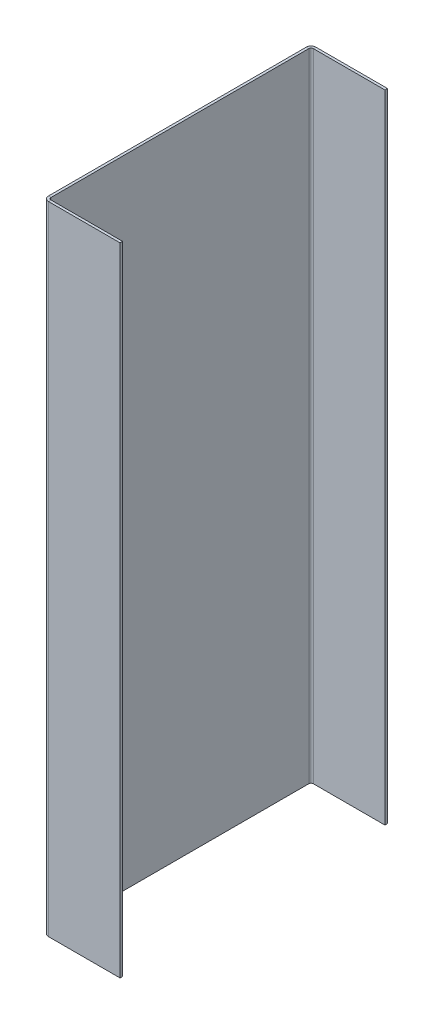
ISO-10303-21;
HEADER;
FILE_DESCRIPTION(('STEP AP214'),'2;1');
FILE_NAME('part.step','',(''),(''),'','','');
FILE_SCHEMA(('AUTOMOTIVE_DESIGN { 1 0 10303 214 1 1 1 1 }'));
ENDSEC;
DATA;
#1=APPLICATION_CONTEXT('core data for automotive mechanical design processes');
#2=APPLICATION_PROTOCOL_DEFINITION('international standard','automotive_design',2000,#1);
#3=PRODUCT_CONTEXT('',#1,'mechanical');
#4=PRODUCT('Part','Part','',(#3));
#5=PRODUCT_RELATED_PRODUCT_CATEGORY('part','',(#4));
#6=PRODUCT_DEFINITION_FORMATION('','',#4);
#7=PRODUCT_DEFINITION_CONTEXT('part definition',#1,'design');
#8=PRODUCT_DEFINITION('design','',#6,#7);
#9=PRODUCT_DEFINITION_SHAPE('','',#8);
#10=(LENGTH_UNIT() NAMED_UNIT(*) SI_UNIT(.MILLI.,.METRE.));
#11=(NAMED_UNIT(*) PLANE_ANGLE_UNIT() SI_UNIT($,.RADIAN.));
#12=(NAMED_UNIT(*) SI_UNIT($,.STERADIAN.) SOLID_ANGLE_UNIT());
#13=UNCERTAINTY_MEASURE_WITH_UNIT(LENGTH_MEASURE(1.E-05),#10,'distance_accuracy_value','');
#14=(GEOMETRIC_REPRESENTATION_CONTEXT(3) GLOBAL_UNCERTAINTY_ASSIGNED_CONTEXT((#13)) GLOBAL_UNIT_ASSIGNED_CONTEXT((#10,
#11,#12)) REPRESENTATION_CONTEXT('',''));
#15=CARTESIAN_POINT('',(0.,0.,0.));
#16=DIRECTION('',(0.,0.,1.));
#17=DIRECTION('',(1.,0.,0.));
#18=AXIS2_PLACEMENT_3D('',#15,#16,#17);
#19=CARTESIAN_POINT('',(2.,0.,210.));
#20=DIRECTION('',(-1.,0.,0.));
#21=DIRECTION('',(0.,0.,1.));
#22=AXIS2_PLACEMENT_3D('',#19,#20,#21);
#23=PLANE('',#22);
#24=DIRECTION('',(0.,-1.,0.));
#25=VECTOR('',#24,1.);
#26=CARTESIAN_POINT('',(2.,0.,206.2));
#27=LINE('',#26,#25);
#28=CARTESIAN_POINT('',(2.,0.,206.2));
#29=VERTEX_POINT('',#28);
#30=CARTESIAN_POINT('',(2.,500.,206.2));
#31=VERTEX_POINT('',#30);
#32=EDGE_CURVE('E218',#29,#31,#27,.F.);
#33=ORIENTED_EDGE('',*,*,#32,.F.);
#34=DIRECTION('',(0.,0.,-1.));
#35=VECTOR('',#34,1.);
#36=CARTESIAN_POINT('',(2.,0.,210.));
#37=LINE('',#36,#35);
#38=CARTESIAN_POINT('',(1.99999999999999,0.,3.79999999999999));
#39=VERTEX_POINT('',#38);
#40=EDGE_CURVE('E275',#29,#39,#37,.T.);
#41=ORIENTED_EDGE('',*,*,#40,.T.);
#42=DIRECTION('',(0.,1.,0.));
#43=VECTOR('',#42,1.);
#44=CARTESIAN_POINT('',(1.99999999999999,500.,3.79999999999999));
#45=LINE('',#44,#43);
#46=CARTESIAN_POINT('',(1.99999999999999,500.,3.79999999999999));
#47=VERTEX_POINT('',#46);
#48=EDGE_CURVE('E269',#47,#39,#45,.F.);
#49=ORIENTED_EDGE('',*,*,#48,.F.);
#50=DIRECTION('',(0.,0.,-1.));
#51=VECTOR('',#50,1.);
#52=CARTESIAN_POINT('',(2.,500.,210.));
#53=LINE('',#52,#51);
#54=EDGE_CURVE('E13',#31,#47,#53,.T.);
#55=ORIENTED_EDGE('',*,*,#54,.F.);
#56=EDGE_LOOP('',(#33,#41,#49,#55));
#57=FACE_BOUND('',#56,.T.);
#58=ADVANCED_FACE('F77',(#57),#23,.F.);
#59=CARTESIAN_POINT('',(0.,0.,210.));
#60=DIRECTION('',(-1.,0.,0.));
#61=DIRECTION('',(0.,0.,1.));
#62=AXIS2_PLACEMENT_3D('',#59,#60,#61);
#63=PLANE('',#62);
#64=DIRECTION('',(0.,0.,-1.));
#65=VECTOR('',#64,1.);
#66=CARTESIAN_POINT('',(0.,0.,210.));
#67=LINE('',#66,#65);
#68=CARTESIAN_POINT('',(0.,0.,206.2));
#69=VERTEX_POINT('',#68);
#70=CARTESIAN_POINT('',(0.,0.,3.79999999999999));
#71=VERTEX_POINT('',#70);
#72=EDGE_CURVE('E280',#69,#71,#67,.T.);
#73=ORIENTED_EDGE('',*,*,#72,.F.);
#74=DIRECTION('',(0.,-1.,0.));
#75=VECTOR('',#74,1.);
#76=CARTESIAN_POINT('',(0.,0.,206.2));
#77=LINE('',#76,#75);
#78=CARTESIAN_POINT('',(0.,500.,206.2));
#79=VERTEX_POINT('',#78);
#80=EDGE_CURVE('E207',#69,#79,#77,.F.);
#81=ORIENTED_EDGE('',*,*,#80,.T.);
#82=DIRECTION('',(0.,0.,-1.));
#83=VECTOR('',#82,1.);
#84=CARTESIAN_POINT('',(0.,500.,210.));
#85=LINE('',#84,#83);
#86=CARTESIAN_POINT('',(0.,500.,3.79999999999999));
#87=VERTEX_POINT('',#86);
#88=EDGE_CURVE('E84',#79,#87,#85,.T.);
#89=ORIENTED_EDGE('',*,*,#88,.T.);
#90=DIRECTION('',(0.,1.,0.));
#91=VECTOR('',#90,1.);
#92=CARTESIAN_POINT('',(0.,500.,3.79999999999999));
#93=LINE('',#92,#91);
#94=EDGE_CURVE('E258',#87,#71,#93,.F.);
#95=ORIENTED_EDGE('',*,*,#94,.T.);
#96=EDGE_LOOP('',(#73,#81,#89,#95));
#97=FACE_BOUND('',#96,.T.);
#98=ADVANCED_FACE('F286',(#97),#63,.T.);
#99=CARTESIAN_POINT('',(2.,0.,210.));
#100=DIRECTION('',(0.,-1.,0.));
#101=DIRECTION('',(0.,0.,-1.));
#102=AXIS2_PLACEMENT_3D('',#99,#100,#101);
#103=PLANE('',#102);
#104=ORIENTED_EDGE('',*,*,#40,.F.);
#105=DIRECTION('',(-1.,0.,0.));
#106=VECTOR('',#105,1.);
#107=CARTESIAN_POINT('',(2.,0.,206.2));
#108=LINE('',#107,#106);
#109=EDGE_CURVE('E212',#29,#69,#108,.T.);
#110=ORIENTED_EDGE('',*,*,#109,.T.);
#111=ORIENTED_EDGE('',*,*,#72,.T.);
#112=DIRECTION('',(-1.,0.,0.));
#113=VECTOR('',#112,1.);
#114=CARTESIAN_POINT('',(1.99999999999999,0.,3.79999999999999));
#115=LINE('',#114,#113);
#116=EDGE_CURVE('E273',#39,#71,#115,.T.);
#117=ORIENTED_EDGE('',*,*,#116,.F.);
#118=EDGE_LOOP('',(#104,#110,#111,#117));
#119=FACE_BOUND('',#118,.T.);
#120=ADVANCED_FACE('F325',(#119),#103,.T.);
#121=CARTESIAN_POINT('',(0.,500.,210.));
#122=DIRECTION('',(0.,1.,0.));
#123=DIRECTION('',(0.,0.,1.));
#124=AXIS2_PLACEMENT_3D('',#121,#122,#123);
#125=PLANE('',#124);
#126=DIRECTION('',(-1.,0.,0.));
#127=VECTOR('',#126,1.);
#128=CARTESIAN_POINT('',(2.,500.,206.2));
#129=LINE('',#128,#127);
#130=EDGE_CURVE('E223',#31,#79,#129,.T.);
#131=ORIENTED_EDGE('',*,*,#130,.F.);
#132=ORIENTED_EDGE('',*,*,#54,.T.);
#133=DIRECTION('',(-1.,0.,0.));
#134=VECTOR('',#133,1.);
#135=CARTESIAN_POINT('',(1.99999999999999,500.,3.79999999999999));
#136=LINE('',#135,#134);
#137=EDGE_CURVE('E263',#47,#87,#136,.T.);
#138=ORIENTED_EDGE('',*,*,#137,.T.);
#139=ORIENTED_EDGE('',*,*,#88,.F.);
#140=EDGE_LOOP('',(#131,#132,#138,#139));
#141=FACE_BOUND('',#140,.T.);
#142=ADVANCED_FACE('F289',(#141),#125,.T.);
#143=CARTESIAN_POINT('',(3.79999999999999,0.,3.79999999999999));
#144=DIRECTION('',(0.,-1.,0.));
#145=DIRECTION('',(0.,0.,-1.));
#146=AXIS2_PLACEMENT_3D('',#143,#144,#145);
#147=PLANE('',#146);
#148=DIRECTION('',(0.,0.,1.));
#149=VECTOR('',#148,1.);
#150=CARTESIAN_POINT('',(3.79999999999999,0.,0.));
#151=LINE('',#150,#149);
#152=CARTESIAN_POINT('',(3.79999999999999,0.,1.99999999999999));
#153=VERTEX_POINT('',#152);
#154=CARTESIAN_POINT('',(3.79999999999998,0.,0.));
#155=VERTEX_POINT('',#154);
#156=EDGE_CURVE('E225',#153,#155,#151,.F.);
#157=ORIENTED_EDGE('',*,*,#156,.F.);
#158=CARTESIAN_POINT('',(3.79999999999999,0.,3.79999999999999));
#159=DIRECTION('',(0.,1.,0.));
#160=DIRECTION('',(0.,0.,1.));
#161=AXIS2_PLACEMENT_3D('',#158,#159,#160);
#162=CIRCLE('',#161,1.8);
#163=EDGE_CURVE('E266',#39,#153,#162,.F.);
#164=ORIENTED_EDGE('',*,*,#163,.F.);
#165=ORIENTED_EDGE('',*,*,#116,.T.);
#166=CARTESIAN_POINT('',(3.79999999999999,0.,3.79999999999999));
#167=DIRECTION('',(0.,1.,0.));
#168=DIRECTION('',(0.,0.,1.));
#169=AXIS2_PLACEMENT_3D('',#166,#167,#168);
#170=CIRCLE('',#169,3.8);
#171=EDGE_CURVE('E91',#71,#155,#170,.F.);
#172=ORIENTED_EDGE('',*,*,#171,.T.);
#173=EDGE_LOOP('',(#157,#164,#165,#172));
#174=FACE_BOUND('',#173,.T.);
#175=ADVANCED_FACE('F321',(#174),#147,.T.);
#176=CARTESIAN_POINT('',(3.79999999999999,500.,3.79999999999999));
#177=DIRECTION('',(0.,-1.,0.));
#178=DIRECTION('',(0.,0.,-1.));
#179=AXIS2_PLACEMENT_3D('',#176,#177,#178);
#180=PLANE('',#179);
#181=CARTESIAN_POINT('',(3.79999999999999,500.,3.79999999999999));
#182=DIRECTION('',(0.,1.,0.));
#183=DIRECTION('',(0.,0.,1.));
#184=AXIS2_PLACEMENT_3D('',#181,#182,#183);
#185=CIRCLE('',#184,1.8);
#186=CARTESIAN_POINT('',(3.79999999999999,500.,1.99999999999999));
#187=VERTEX_POINT('',#186);
#188=EDGE_CURVE('E231',#187,#47,#185,.T.);
#189=ORIENTED_EDGE('',*,*,#188,.F.);
#190=DIRECTION('',(0.,0.,1.));
#191=VECTOR('',#190,1.);
#192=CARTESIAN_POINT('',(3.79999999999999,500.,1.99999999999999));
#193=LINE('',#192,#191);
#194=CARTESIAN_POINT('',(3.79999999999999,500.,0.));
#195=VERTEX_POINT('',#194);
#196=EDGE_CURVE('E251',#187,#195,#193,.F.);
#197=ORIENTED_EDGE('',*,*,#196,.T.);
#198=CARTESIAN_POINT('',(3.79999999999999,500.,3.79999999999999));
#199=DIRECTION('',(0.,1.,0.));
#200=DIRECTION('',(0.,0.,1.));
#201=AXIS2_PLACEMENT_3D('',#198,#199,#200);
#202=CIRCLE('',#201,3.8);
#203=EDGE_CURVE('E261',#195,#87,#202,.T.);
#204=ORIENTED_EDGE('',*,*,#203,.T.);
#205=ORIENTED_EDGE('',*,*,#137,.F.);
#206=EDGE_LOOP('',(#189,#197,#204,#205));
#207=FACE_BOUND('',#206,.T.);
#208=ADVANCED_FACE('F294',(#207),#180,.F.);
#209=CARTESIAN_POINT('',(3.79999999999999,500.,3.79999999999999));
#210=DIRECTION('',(0.,1.,0.));
#211=DIRECTION('',(0.,0.,-1.));
#212=AXIS2_PLACEMENT_3D('',#209,#210,#211);
#213=CYLINDRICAL_SURFACE('',#212,3.8);
#214=ORIENTED_EDGE('',*,*,#94,.F.);
#215=ORIENTED_EDGE('',*,*,#203,.F.);
#216=DIRECTION('',(0.,1.,0.));
#217=VECTOR('',#216,1.);
#218=CARTESIAN_POINT('',(3.79999999999999,0.,0.));
#219=LINE('',#218,#217);
#220=EDGE_CURVE('E249',#195,#155,#219,.F.);
#221=ORIENTED_EDGE('',*,*,#220,.T.);
#222=ORIENTED_EDGE('',*,*,#171,.F.);
#223=EDGE_LOOP('',(#214,#215,#221,#222));
#224=FACE_BOUND('',#223,.T.);
#225=ADVANCED_FACE('F319',(#224),#213,.T.);
#226=CARTESIAN_POINT('',(3.79999999999999,500.,3.79999999999999));
#227=DIRECTION('',(0.,1.,0.));
#228=DIRECTION('',(0.,0.,-1.));
#229=AXIS2_PLACEMENT_3D('',#226,#227,#228);
#230=CYLINDRICAL_SURFACE('',#229,1.8);
#231=ORIENTED_EDGE('',*,*,#48,.T.);
#232=ORIENTED_EDGE('',*,*,#163,.T.);
#233=DIRECTION('',(0.,1.,0.));
#234=VECTOR('',#233,1.);
#235=CARTESIAN_POINT('',(3.79999999999999,0.,1.99999999999999));
#236=LINE('',#235,#234);
#237=EDGE_CURVE('E254',#153,#187,#236,.T.);
#238=ORIENTED_EDGE('',*,*,#237,.T.);
#239=ORIENTED_EDGE('',*,*,#188,.T.);
#240=EDGE_LOOP('',(#231,#232,#238,#239));
#241=FACE_BOUND('',#240,.T.);
#242=ADVANCED_FACE('F297',(#241),#230,.F.);
#243=CARTESIAN_POINT('',(1.99999999999999,0.,0.));
#244=DIRECTION('',(0.,1.,0.));
#245=DIRECTION('',(0.,0.,1.));
#246=AXIS2_PLACEMENT_3D('',#243,#244,#245);
#247=PLANE('',#246);
#248=ORIENTED_EDGE('',*,*,#156,.T.);
#249=DIRECTION('',(-1.,0.,0.));
#250=VECTOR('',#249,1.);
#251=CARTESIAN_POINT('',(60.,0.,-2.02528965820292E-13));
#252=LINE('',#251,#250);
#253=CARTESIAN_POINT('',(60.,0.,-2.02528965820292E-13));
#254=VERTEX_POINT('',#253);
#255=EDGE_CURVE('E239',#254,#155,#252,.T.);
#256=ORIENTED_EDGE('',*,*,#255,.F.);
#257=DIRECTION('',(0.,0.,1.));
#258=VECTOR('',#257,1.);
#259=CARTESIAN_POINT('',(60.,0.,-2.02505917652902E-13));
#260=LINE('',#259,#258);
#261=CARTESIAN_POINT('',(60.,0.,1.9999999999998));
#262=VERTEX_POINT('',#261);
#263=EDGE_CURVE('E232',#254,#262,#260,.T.);
#264=ORIENTED_EDGE('',*,*,#263,.T.);
#265=DIRECTION('',(1.,0.,0.));
#266=VECTOR('',#265,1.);
#267=CARTESIAN_POINT('',(2.,0.,2.));
#268=LINE('',#267,#266);
#269=EDGE_CURVE('E246',#262,#153,#268,.F.);
#270=ORIENTED_EDGE('',*,*,#269,.T.);
#271=EDGE_LOOP('',(#248,#256,#264,#270));
#272=FACE_BOUND('',#271,.T.);
#273=ADVANCED_FACE('F306',(#272),#247,.F.);
#274=CARTESIAN_POINT('',(60.,500.,-2.02528965820292E-13));
#275=DIRECTION('',(0.,-1.,0.));
#276=DIRECTION('',(0.,0.,-1.));
#277=AXIS2_PLACEMENT_3D('',#274,#275,#276);
#278=PLANE('',#277);
#279=ORIENTED_EDGE('',*,*,#196,.F.);
#280=DIRECTION('',(-1.,0.,0.));
#281=VECTOR('',#280,1.);
#282=CARTESIAN_POINT('',(60.,500.,1.9999999999998));
#283=LINE('',#282,#281);
#284=CARTESIAN_POINT('',(60.,500.,1.9999999999998));
#285=VERTEX_POINT('',#284);
#286=EDGE_CURVE('E244',#187,#285,#283,.F.);
#287=ORIENTED_EDGE('',*,*,#286,.T.);
#288=DIRECTION('',(0.,0.,1.));
#289=VECTOR('',#288,1.);
#290=CARTESIAN_POINT('',(60.,500.,-2.02528965820292E-13));
#291=LINE('',#290,#289);
#292=CARTESIAN_POINT('',(60.,500.,-2.02528965820292E-13));
#293=VERTEX_POINT('',#292);
#294=EDGE_CURVE('E228',#293,#285,#291,.T.);
#295=ORIENTED_EDGE('',*,*,#294,.F.);
#296=DIRECTION('',(1.,0.,0.));
#297=VECTOR('',#296,1.);
#298=CARTESIAN_POINT('',(60.,500.,-2.02528965820292E-13));
#299=LINE('',#298,#297);
#300=EDGE_CURVE('E237',#195,#293,#299,.T.);
#301=ORIENTED_EDGE('',*,*,#300,.F.);
#302=EDGE_LOOP('',(#279,#287,#295,#301));
#303=FACE_BOUND('',#302,.T.);
#304=ADVANCED_FACE('F315',(#303),#278,.F.);
#305=CARTESIAN_POINT('',(60.,0.,-2.02528965820292E-13));
#306=DIRECTION('',(0.,0.,1.));
#307=DIRECTION('',(1.,0.,0.));
#308=AXIS2_PLACEMENT_3D('',#305,#306,#307);
#309=PLANE('',#308);
#310=ORIENTED_EDGE('',*,*,#220,.F.);
#311=ORIENTED_EDGE('',*,*,#300,.T.);
#312=DIRECTION('',(0.,-1.,0.));
#313=VECTOR('',#312,1.);
#314=CARTESIAN_POINT('',(60.,0.,-2.02528965820292E-13));
#315=LINE('',#314,#313);
#316=EDGE_CURVE('E235',#293,#254,#315,.T.);
#317=ORIENTED_EDGE('',*,*,#316,.T.);
#318=ORIENTED_EDGE('',*,*,#255,.T.);
#319=EDGE_LOOP('',(#310,#311,#317,#318));
#320=FACE_BOUND('',#319,.T.);
#321=ADVANCED_FACE('F318',(#320),#309,.F.);
#322=CARTESIAN_POINT('',(60.,0.,1.9999999999998));
#323=DIRECTION('',(0.,0.,1.));
#324=DIRECTION('',(1.,0.,0.));
#325=AXIS2_PLACEMENT_3D('',#322,#323,#324);
#326=PLANE('',#325);
#327=ORIENTED_EDGE('',*,*,#286,.F.);
#328=ORIENTED_EDGE('',*,*,#237,.F.);
#329=ORIENTED_EDGE('',*,*,#269,.F.);
#330=DIRECTION('',(0.,1.,0.));
#331=VECTOR('',#330,1.);
#332=CARTESIAN_POINT('',(60.,0.,1.9999999999998));
#333=LINE('',#332,#331);
#334=EDGE_CURVE('E242',#285,#262,#333,.F.);
#335=ORIENTED_EDGE('',*,*,#334,.F.);
#336=EDGE_LOOP('',(#327,#328,#329,#335));
#337=FACE_BOUND('',#336,.T.);
#338=ADVANCED_FACE('F303',(#337),#326,.T.);
#339=CARTESIAN_POINT('',(60.,0.,-2.02528965820292E-13));
#340=DIRECTION('',(-1.,0.,0.));
#341=DIRECTION('',(0.,0.,1.));
#342=AXIS2_PLACEMENT_3D('',#339,#340,#341);
#343=PLANE('',#342);
#344=ORIENTED_EDGE('',*,*,#334,.T.);
#345=ORIENTED_EDGE('',*,*,#263,.F.);
#346=ORIENTED_EDGE('',*,*,#316,.F.);
#347=ORIENTED_EDGE('',*,*,#294,.T.);
#348=EDGE_LOOP('',(#344,#345,#346,#347));
#349=FACE_BOUND('',#348,.T.);
#350=ADVANCED_FACE('F311',(#349),#343,.F.);
#351=CARTESIAN_POINT('',(3.8,500.,206.2));
#352=DIRECTION('',(0.,1.,0.));
#353=DIRECTION('',(0.,0.,1.));
#354=AXIS2_PLACEMENT_3D('',#351,#352,#353);
#355=PLANE('',#354);
#356=DIRECTION('',(0.,0.,-1.));
#357=VECTOR('',#356,1.);
#358=CARTESIAN_POINT('',(3.8,500.,210.));
#359=LINE('',#358,#357);
#360=CARTESIAN_POINT('',(3.79999999999999,500.,208.));
#361=VERTEX_POINT('',#360);
#362=CARTESIAN_POINT('',(3.79999999999998,500.,210.));
#363=VERTEX_POINT('',#362);
#364=EDGE_CURVE('E189',#361,#363,#359,.F.);
#365=ORIENTED_EDGE('',*,*,#364,.F.);
#366=CARTESIAN_POINT('',(3.8,500.,206.2));
#367=DIRECTION('',(0.,-1.,0.));
#368=DIRECTION('',(0.,0.,-1.));
#369=AXIS2_PLACEMENT_3D('',#366,#367,#368);
#370=CIRCLE('',#369,1.8);
#371=EDGE_CURVE('E215',#31,#361,#370,.F.);
#372=ORIENTED_EDGE('',*,*,#371,.F.);
#373=ORIENTED_EDGE('',*,*,#130,.T.);
#374=CARTESIAN_POINT('',(3.8,500.,206.2));
#375=DIRECTION('',(0.,-1.,0.));
#376=DIRECTION('',(0.,0.,-1.));
#377=AXIS2_PLACEMENT_3D('',#374,#375,#376);
#378=CIRCLE('',#377,3.8);
#379=EDGE_CURVE('E99',#79,#363,#378,.F.);
#380=ORIENTED_EDGE('',*,*,#379,.T.);
#381=EDGE_LOOP('',(#365,#372,#373,#380));
#382=FACE_BOUND('',#381,.T.);
#383=ADVANCED_FACE('F365',(#382),#355,.T.);
#384=CARTESIAN_POINT('',(3.8,0.,206.2));
#385=DIRECTION('',(0.,1.,0.));
#386=DIRECTION('',(0.,0.,1.));
#387=AXIS2_PLACEMENT_3D('',#384,#385,#386);
#388=PLANE('',#387);
#389=CARTESIAN_POINT('',(3.8,0.,206.2));
#390=DIRECTION('',(0.,-1.,0.));
#391=DIRECTION('',(0.,0.,-1.));
#392=AXIS2_PLACEMENT_3D('',#389,#390,#391);
#393=CIRCLE('',#392,1.8);
#394=CARTESIAN_POINT('',(3.79999999999999,0.,208.));
#395=VERTEX_POINT('',#394);
#396=EDGE_CURVE('E220',#395,#29,#393,.T.);
#397=ORIENTED_EDGE('',*,*,#396,.F.);
#398=DIRECTION('',(0.,0.,-1.));
#399=VECTOR('',#398,1.);
#400=CARTESIAN_POINT('',(3.8,0.,208.));
#401=LINE('',#400,#399);
#402=CARTESIAN_POINT('',(3.8,0.,210.));
#403=VERTEX_POINT('',#402);
#404=EDGE_CURVE('E201',#395,#403,#401,.F.);
#405=ORIENTED_EDGE('',*,*,#404,.T.);
#406=CARTESIAN_POINT('',(3.8,0.,206.2));
#407=DIRECTION('',(0.,-1.,0.));
#408=DIRECTION('',(0.,0.,-1.));
#409=AXIS2_PLACEMENT_3D('',#406,#407,#408);
#410=CIRCLE('',#409,3.8);
#411=EDGE_CURVE('E210',#403,#69,#410,.T.);
#412=ORIENTED_EDGE('',*,*,#411,.T.);
#413=ORIENTED_EDGE('',*,*,#109,.F.);
#414=EDGE_LOOP('',(#397,#405,#412,#413));
#415=FACE_BOUND('',#414,.T.);
#416=ADVANCED_FACE('F328',(#415),#388,.F.);
#417=CARTESIAN_POINT('',(3.8,0.,206.2));
#418=DIRECTION('',(0.,-1.,0.));
#419=DIRECTION('',(0.,0.,1.));
#420=AXIS2_PLACEMENT_3D('',#417,#418,#419);
#421=CYLINDRICAL_SURFACE('',#420,3.8);
#422=ORIENTED_EDGE('',*,*,#80,.F.);
#423=ORIENTED_EDGE('',*,*,#411,.F.);
#424=DIRECTION('',(0.,-1.,0.));
#425=VECTOR('',#424,1.);
#426=CARTESIAN_POINT('',(3.8,500.,210.));
#427=LINE('',#426,#425);
#428=EDGE_CURVE('E199',#403,#363,#427,.F.);
#429=ORIENTED_EDGE('',*,*,#428,.T.);
#430=ORIENTED_EDGE('',*,*,#379,.F.);
#431=EDGE_LOOP('',(#422,#423,#429,#430));
#432=FACE_BOUND('',#431,.T.);
#433=ADVANCED_FACE('F372',(#432),#421,.T.);
#434=CARTESIAN_POINT('',(3.8,0.,206.2));
#435=DIRECTION('',(0.,-1.,0.));
#436=DIRECTION('',(0.,0.,1.));
#437=AXIS2_PLACEMENT_3D('',#434,#435,#436);
#438=CYLINDRICAL_SURFACE('',#437,1.8);
#439=ORIENTED_EDGE('',*,*,#32,.T.);
#440=ORIENTED_EDGE('',*,*,#371,.T.);
#441=DIRECTION('',(0.,-1.,0.));
#442=VECTOR('',#441,1.);
#443=CARTESIAN_POINT('',(3.8,500.,208.));
#444=LINE('',#443,#442);
#445=EDGE_CURVE('E204',#361,#395,#444,.T.);
#446=ORIENTED_EDGE('',*,*,#445,.T.);
#447=ORIENTED_EDGE('',*,*,#396,.T.);
#448=EDGE_LOOP('',(#439,#440,#446,#447));
#449=FACE_BOUND('',#448,.T.);
#450=ADVANCED_FACE('F332',(#449),#438,.F.);
#451=CARTESIAN_POINT('',(60.,0.,210.));
#452=DIRECTION('',(0.,1.,0.));
#453=DIRECTION('',(0.,0.,1.));
#454=AXIS2_PLACEMENT_3D('',#451,#452,#453);
#455=PLANE('',#454);
#456=ORIENTED_EDGE('',*,*,#404,.F.);
#457=DIRECTION('',(-1.,0.,0.));
#458=VECTOR('',#457,1.);
#459=CARTESIAN_POINT('',(60.,0.,208.));
#460=LINE('',#459,#458);
#461=CARTESIAN_POINT('',(60.,0.,208.));
#462=VERTEX_POINT('',#461);
#463=EDGE_CURVE('E197',#395,#462,#460,.F.);
#464=ORIENTED_EDGE('',*,*,#463,.T.);
#465=DIRECTION('',(0.,0.,-1.));
#466=VECTOR('',#465,1.);
#467=CARTESIAN_POINT('',(60.,0.,210.));
#468=LINE('',#467,#466);
#469=CARTESIAN_POINT('',(60.,0.,210.));
#470=VERTEX_POINT('',#469);
#471=EDGE_CURVE('E185',#470,#462,#468,.T.);
#472=ORIENTED_EDGE('',*,*,#471,.F.);
#473=DIRECTION('',(1.,0.,0.));
#474=VECTOR('',#473,1.);
#475=CARTESIAN_POINT('',(1.99999999999999,0.,210.));
#476=LINE('',#475,#474);
#477=EDGE_CURVE('E172',#403,#470,#476,.T.);
#478=ORIENTED_EDGE('',*,*,#477,.F.);
#479=EDGE_LOOP('',(#456,#464,#472,#478));
#480=FACE_BOUND('',#479,.T.);
#481=ADVANCED_FACE('F378',(#480),#455,.F.);
#482=CARTESIAN_POINT('',(1.99999999999999,500.,210.));
#483=DIRECTION('',(0.,-1.,0.));
#484=DIRECTION('',(0.,0.,-1.));
#485=AXIS2_PLACEMENT_3D('',#482,#483,#484);
#486=PLANE('',#485);
#487=ORIENTED_EDGE('',*,*,#364,.T.);
#488=DIRECTION('',(-1.,0.,0.));
#489=VECTOR('',#488,1.);
#490=CARTESIAN_POINT('',(1.99999999999999,500.,210.));
#491=LINE('',#490,#489);
#492=CARTESIAN_POINT('',(60.,500.,210.));
#493=VERTEX_POINT('',#492);
#494=EDGE_CURVE('E170',#493,#363,#491,.T.);
#495=ORIENTED_EDGE('',*,*,#494,.F.);
#496=DIRECTION('',(0.,0.,-1.));
#497=VECTOR('',#496,1.);
#498=CARTESIAN_POINT('',(60.,500.,210.));
#499=LINE('',#498,#497);
#500=CARTESIAN_POINT('',(60.,500.,208.));
#501=VERTEX_POINT('',#500);
#502=EDGE_CURVE('E178',#493,#501,#499,.T.);
#503=ORIENTED_EDGE('',*,*,#502,.T.);
#504=DIRECTION('',(1.,0.,0.));
#505=VECTOR('',#504,1.);
#506=CARTESIAN_POINT('',(2.,500.,208.));
#507=LINE('',#506,#505);
#508=EDGE_CURVE('E194',#501,#361,#507,.F.);
#509=ORIENTED_EDGE('',*,*,#508,.T.);
#510=EDGE_LOOP('',(#487,#495,#503,#509));
#511=FACE_BOUND('',#510,.T.);
#512=ADVANCED_FACE('F188',(#511),#486,.F.);
#513=CARTESIAN_POINT('',(1.99999999999999,0.,210.));
#514=DIRECTION('',(0.,0.,-1.));
#515=DIRECTION('',(-1.,0.,0.));
#516=AXIS2_PLACEMENT_3D('',#513,#514,#515);
#517=PLANE('',#516);
#518=ORIENTED_EDGE('',*,*,#428,.F.);
#519=ORIENTED_EDGE('',*,*,#477,.T.);
#520=DIRECTION('',(0.,1.,0.));
#521=VECTOR('',#520,1.);
#522=CARTESIAN_POINT('',(60.,0.,210.));
#523=LINE('',#522,#521);
#524=EDGE_CURVE('E165',#470,#493,#523,.T.);
#525=ORIENTED_EDGE('',*,*,#524,.T.);
#526=ORIENTED_EDGE('',*,*,#494,.T.);
#527=EDGE_LOOP('',(#518,#519,#525,#526));
#528=FACE_BOUND('',#527,.T.);
#529=ADVANCED_FACE('F168',(#528),#517,.F.);
#530=CARTESIAN_POINT('',(2.,0.,208.));
#531=DIRECTION('',(0.,0.,-1.));
#532=DIRECTION('',(-1.,0.,0.));
#533=AXIS2_PLACEMENT_3D('',#530,#531,#532);
#534=PLANE('',#533);
#535=ORIENTED_EDGE('',*,*,#463,.F.);
#536=ORIENTED_EDGE('',*,*,#445,.F.);
#537=ORIENTED_EDGE('',*,*,#508,.F.);
#538=DIRECTION('',(0.,-1.,0.));
#539=VECTOR('',#538,1.);
#540=CARTESIAN_POINT('',(60.,500.,208.));
#541=LINE('',#540,#539);
#542=EDGE_CURVE('E181',#462,#501,#541,.F.);
#543=ORIENTED_EDGE('',*,*,#542,.F.);
#544=EDGE_LOOP('',(#535,#536,#537,#543));
#545=FACE_BOUND('',#544,.T.);
#546=ADVANCED_FACE('F386',(#545),#534,.T.);
#547=CARTESIAN_POINT('',(60.,500.,210.));
#548=DIRECTION('',(-1.,0.,0.));
#549=DIRECTION('',(0.,0.,1.));
#550=AXIS2_PLACEMENT_3D('',#547,#548,#549);
#551=PLANE('',#550);
#552=ORIENTED_EDGE('',*,*,#542,.T.);
#553=ORIENTED_EDGE('',*,*,#502,.F.);
#554=ORIENTED_EDGE('',*,*,#524,.F.);
#555=ORIENTED_EDGE('',*,*,#471,.T.);
#556=EDGE_LOOP('',(#552,#553,#554,#555));
#557=FACE_BOUND('',#556,.T.);
#558=ADVANCED_FACE('F179',(#557),#551,.F.);
#559=CLOSED_SHELL('',(#58,#98,#120,#142,#175,#208,#225,#242,#273,#304,#321,#338,#350,#383,#416,
#433,#450,#481,#512,#529,#546,#558));
#560=MANIFOLD_SOLID_BREP('B2',#559);
#561=ADVANCED_BREP_SHAPE_REPRESENTATION('',(#18,#560),#14);
#562=SHAPE_DEFINITION_REPRESENTATION(#9,#561);
ENDSEC;
END-ISO-10303-21;
